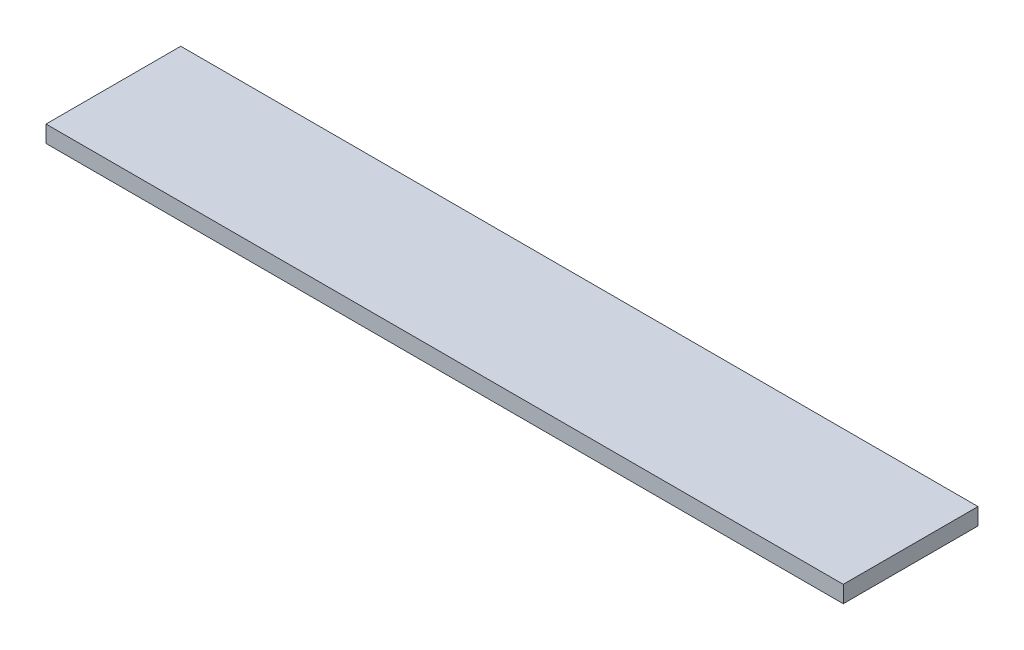
ISO-10303-21;
HEADER;
FILE_DESCRIPTION(('STEP AP214'),'2;1');
FILE_NAME('part.step','',(''),(''),'','','');
FILE_SCHEMA(('AUTOMOTIVE_DESIGN { 1 0 10303 214 1 1 1 1 }'));
ENDSEC;
DATA;
#1=APPLICATION_CONTEXT('core data for automotive mechanical design processes');
#2=APPLICATION_PROTOCOL_DEFINITION('international standard','automotive_design',2000,#1);
#3=PRODUCT_CONTEXT('',#1,'mechanical');
#4=PRODUCT('Part','Part','',(#3));
#5=PRODUCT_RELATED_PRODUCT_CATEGORY('part','',(#4));
#6=PRODUCT_DEFINITION_FORMATION('','',#4);
#7=PRODUCT_DEFINITION_CONTEXT('part definition',#1,'design');
#8=PRODUCT_DEFINITION('design','',#6,#7);
#9=PRODUCT_DEFINITION_SHAPE('','',#8);
#10=(LENGTH_UNIT() NAMED_UNIT(*) SI_UNIT(.MILLI.,.METRE.));
#11=(NAMED_UNIT(*) PLANE_ANGLE_UNIT() SI_UNIT($,.RADIAN.));
#12=(NAMED_UNIT(*) SI_UNIT($,.STERADIAN.) SOLID_ANGLE_UNIT());
#13=UNCERTAINTY_MEASURE_WITH_UNIT(LENGTH_MEASURE(1.E-05),#10,'distance_accuracy_value','');
#14=(GEOMETRIC_REPRESENTATION_CONTEXT(3) GLOBAL_UNCERTAINTY_ASSIGNED_CONTEXT((#13)) GLOBAL_UNIT_ASSIGNED_CONTEXT((#10,
#11,#12)) REPRESENTATION_CONTEXT('',''));
#15=CARTESIAN_POINT('',(0.,0.,0.));
#16=DIRECTION('',(0.,0.,1.));
#17=DIRECTION('',(1.,0.,0.));
#18=AXIS2_PLACEMENT_3D('',#15,#16,#17);
#19=CARTESIAN_POINT('',(-450.85,9.525,76.2));
#20=DIRECTION('',(1.,0.,0.));
#21=DIRECTION('',(0.,0.,-1.));
#22=AXIS2_PLACEMENT_3D('',#19,#20,#21);
#23=PLANE('',#22);
#24=DIRECTION('',(0.,0.,1.));
#25=VECTOR('',#24,1.);
#26=CARTESIAN_POINT('',(-450.85,-9.525,76.2));
#27=LINE('',#26,#25);
#28=CARTESIAN_POINT('',(-450.85,-9.525,-76.2));
#29=VERTEX_POINT('',#28);
#30=CARTESIAN_POINT('',(-450.85,-9.525,76.2));
#31=VERTEX_POINT('',#30);
#32=EDGE_CURVE('E95',#29,#31,#27,.T.);
#33=ORIENTED_EDGE('',*,*,#32,.T.);
#34=DIRECTION('',(0.,-1.,0.));
#35=VECTOR('',#34,1.);
#36=CARTESIAN_POINT('',(-450.85,9.525,76.2));
#37=LINE('',#36,#35);
#38=CARTESIAN_POINT('',(-450.85,9.525,76.2));
#39=VERTEX_POINT('',#38);
#40=EDGE_CURVE('E11',#39,#31,#37,.T.);
#41=ORIENTED_EDGE('',*,*,#40,.F.);
#42=DIRECTION('',(0.,0.,1.));
#43=VECTOR('',#42,1.);
#44=CARTESIAN_POINT('',(-450.85,9.525,76.2));
#45=LINE('',#44,#43);
#46=CARTESIAN_POINT('',(-450.85,9.525,-76.2));
#47=VERTEX_POINT('',#46);
#48=EDGE_CURVE('E83',#47,#39,#45,.T.);
#49=ORIENTED_EDGE('',*,*,#48,.F.);
#50=DIRECTION('',(0.,-1.,0.));
#51=VECTOR('',#50,1.);
#52=CARTESIAN_POINT('',(-450.85,9.525,-76.2));
#53=LINE('',#52,#51);
#54=EDGE_CURVE('E91',#47,#29,#53,.T.);
#55=ORIENTED_EDGE('',*,*,#54,.T.);
#56=EDGE_LOOP('',(#33,#41,#49,#55));
#57=FACE_BOUND('',#56,.T.);
#58=ADVANCED_FACE('F32',(#57),#23,.F.);
#59=CARTESIAN_POINT('',(450.85,9.525,76.1999999999999));
#60=DIRECTION('',(0.,0.,-1.));
#61=DIRECTION('',(-1.,0.,0.));
#62=AXIS2_PLACEMENT_3D('',#59,#60,#61);
#63=PLANE('',#62);
#64=DIRECTION('',(1.,0.,0.));
#65=VECTOR('',#64,1.);
#66=CARTESIAN_POINT('',(450.85,-9.525,76.1999999999999));
#67=LINE('',#66,#65);
#68=CARTESIAN_POINT('',(450.85,-9.525,76.1999999999999));
#69=VERTEX_POINT('',#68);
#70=EDGE_CURVE('E87',#31,#69,#67,.T.);
#71=ORIENTED_EDGE('',*,*,#70,.T.);
#72=DIRECTION('',(0.,-1.,0.));
#73=VECTOR('',#72,1.);
#74=CARTESIAN_POINT('',(450.85,9.525,76.1999999999999));
#75=LINE('',#74,#73);
#76=CARTESIAN_POINT('',(450.85,9.525,76.1999999999999));
#77=VERTEX_POINT('',#76);
#78=EDGE_CURVE('E40',#77,#69,#75,.T.);
#79=ORIENTED_EDGE('',*,*,#78,.F.);
#80=DIRECTION('',(1.,0.,0.));
#81=VECTOR('',#80,1.);
#82=CARTESIAN_POINT('',(450.85,9.525,76.1999999999999));
#83=LINE('',#82,#81);
#84=EDGE_CURVE('E78',#39,#77,#83,.T.);
#85=ORIENTED_EDGE('',*,*,#84,.F.);
#86=ORIENTED_EDGE('',*,*,#40,.T.);
#87=EDGE_LOOP('',(#71,#79,#85,#86));
#88=FACE_BOUND('',#87,.T.);
#89=ADVANCED_FACE('F86',(#88),#63,.F.);
#90=CARTESIAN_POINT('',(450.85,9.525,76.1999999999999));
#91=DIRECTION('',(-1.,0.,0.));
#92=DIRECTION('',(0.,0.,1.));
#93=AXIS2_PLACEMENT_3D('',#90,#91,#92);
#94=PLANE('',#93);
#95=DIRECTION('',(0.,0.,-1.));
#96=VECTOR('',#95,1.);
#97=CARTESIAN_POINT('',(450.85,-9.525,76.1999999999999));
#98=LINE('',#97,#96);
#99=CARTESIAN_POINT('',(450.85,-9.525,-76.2000000000001));
#100=VERTEX_POINT('',#99);
#101=EDGE_CURVE('E65',#69,#100,#98,.T.);
#102=ORIENTED_EDGE('',*,*,#101,.T.);
#103=DIRECTION('',(0.,-1.,0.));
#104=VECTOR('',#103,1.);
#105=CARTESIAN_POINT('',(450.85,9.525,-76.2000000000001));
#106=LINE('',#105,#104);
#107=CARTESIAN_POINT('',(450.85,9.525,-76.2000000000001));
#108=VERTEX_POINT('',#107);
#109=EDGE_CURVE('E88',#108,#100,#106,.T.);
#110=ORIENTED_EDGE('',*,*,#109,.F.);
#111=DIRECTION('',(0.,0.,-1.));
#112=VECTOR('',#111,1.);
#113=CARTESIAN_POINT('',(450.85,9.525,76.1999999999999));
#114=LINE('',#113,#112);
#115=EDGE_CURVE('E81',#77,#108,#114,.T.);
#116=ORIENTED_EDGE('',*,*,#115,.F.);
#117=ORIENTED_EDGE('',*,*,#78,.T.);
#118=EDGE_LOOP('',(#102,#110,#116,#117));
#119=FACE_BOUND('',#118,.T.);
#120=ADVANCED_FACE('F89',(#119),#94,.F.);
#121=CARTESIAN_POINT('',(450.85,9.525,-76.2000000000001));
#122=DIRECTION('',(0.,0.,1.));
#123=DIRECTION('',(1.,0.,0.));
#124=AXIS2_PLACEMENT_3D('',#121,#122,#123);
#125=PLANE('',#124);
#126=DIRECTION('',(-1.,0.,0.));
#127=VECTOR('',#126,1.);
#128=CARTESIAN_POINT('',(450.85,-9.525,-76.2000000000001));
#129=LINE('',#128,#127);
#130=EDGE_CURVE('E71',#100,#29,#129,.T.);
#131=ORIENTED_EDGE('',*,*,#130,.T.);
#132=ORIENTED_EDGE('',*,*,#54,.F.);
#133=DIRECTION('',(-1.,0.,0.));
#134=VECTOR('',#133,1.);
#135=CARTESIAN_POINT('',(450.85,9.525,-76.2000000000001));
#136=LINE('',#135,#134);
#137=EDGE_CURVE('E48',#108,#47,#136,.T.);
#138=ORIENTED_EDGE('',*,*,#137,.F.);
#139=ORIENTED_EDGE('',*,*,#109,.T.);
#140=EDGE_LOOP('',(#131,#132,#138,#139));
#141=FACE_BOUND('',#140,.T.);
#142=ADVANCED_FACE('F102',(#141),#125,.F.);
#143=CARTESIAN_POINT('',(0.,9.525,0.));
#144=DIRECTION('',(0.,1.,0.));
#145=DIRECTION('',(0.,0.,1.));
#146=AXIS2_PLACEMENT_3D('',#143,#144,#145);
#147=PLANE('',#146);
#148=ORIENTED_EDGE('',*,*,#48,.T.);
#149=ORIENTED_EDGE('',*,*,#84,.T.);
#150=ORIENTED_EDGE('',*,*,#115,.T.);
#151=ORIENTED_EDGE('',*,*,#137,.T.);
#152=EDGE_LOOP('',(#148,#149,#150,#151));
#153=FACE_BOUND('',#152,.T.);
#154=ADVANCED_FACE('F79',(#153),#147,.T.);
#155=CARTESIAN_POINT('',(0.,-9.525,0.));
#156=DIRECTION('',(0.,1.,0.));
#157=DIRECTION('',(0.,0.,1.));
#158=AXIS2_PLACEMENT_3D('',#155,#156,#157);
#159=PLANE('',#158);
#160=ORIENTED_EDGE('',*,*,#32,.F.);
#161=ORIENTED_EDGE('',*,*,#130,.F.);
#162=ORIENTED_EDGE('',*,*,#101,.F.);
#163=ORIENTED_EDGE('',*,*,#70,.F.);
#164=EDGE_LOOP('',(#160,#161,#162,#163));
#165=FACE_BOUND('',#164,.T.);
#166=ADVANCED_FACE('F105',(#165),#159,.F.);
#167=CLOSED_SHELL('',(#58,#89,#120,#142,#154,#166));
#168=MANIFOLD_SOLID_BREP('B2',#167);
#169=ADVANCED_BREP_SHAPE_REPRESENTATION('',(#18,#168),#14);
#170=SHAPE_DEFINITION_REPRESENTATION(#9,#169);
ENDSEC;
END-ISO-10303-21;
